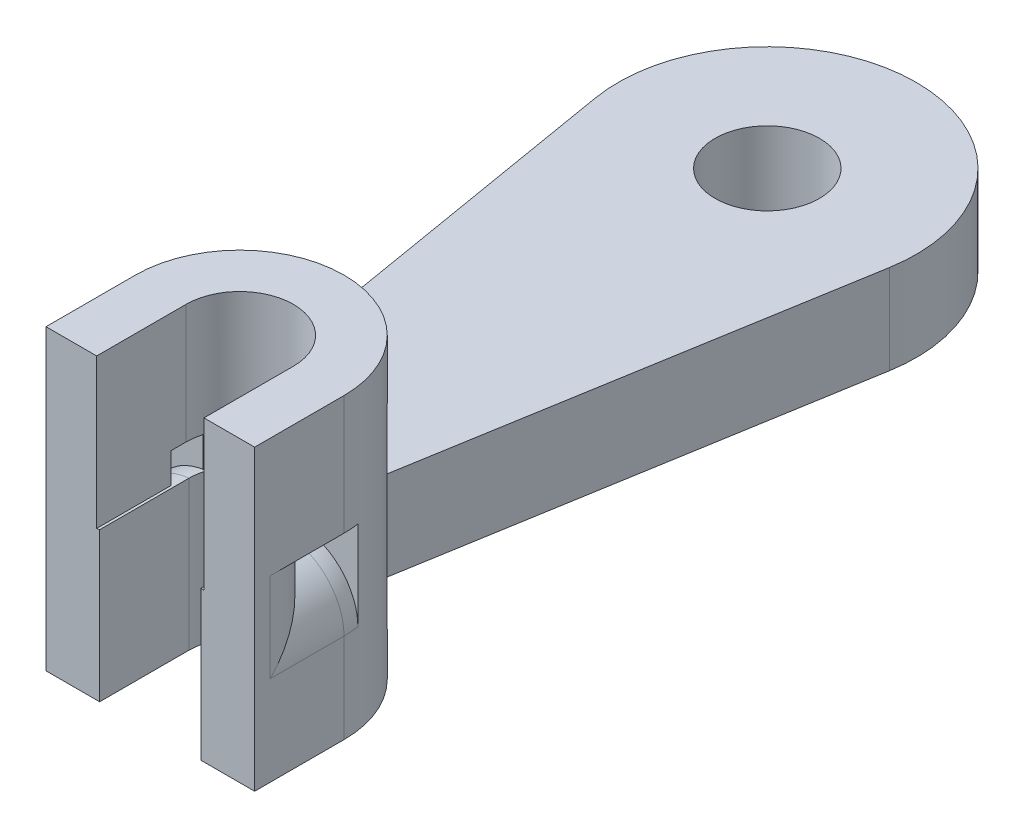
ISO-10303-21;
HEADER;
FILE_DESCRIPTION(('STEP AP214'),'2;1');
FILE_NAME('part.step','',(''),(''),'','','');
FILE_SCHEMA(('AUTOMOTIVE_DESIGN { 1 0 10303 214 1 1 1 1 }'));
ENDSEC;
DATA;
#1=APPLICATION_CONTEXT('core data for automotive mechanical design processes');
#2=APPLICATION_PROTOCOL_DEFINITION('international standard','automotive_design',2000,#1);
#3=PRODUCT_CONTEXT('',#1,'mechanical');
#4=PRODUCT('Part','Part','',(#3));
#5=PRODUCT_RELATED_PRODUCT_CATEGORY('part','',(#4));
#6=PRODUCT_DEFINITION_FORMATION('','',#4);
#7=PRODUCT_DEFINITION_CONTEXT('part definition',#1,'design');
#8=PRODUCT_DEFINITION('design','',#6,#7);
#9=PRODUCT_DEFINITION_SHAPE('','',#8);
#10=(LENGTH_UNIT() NAMED_UNIT(*) SI_UNIT(.MILLI.,.METRE.));
#11=(NAMED_UNIT(*) PLANE_ANGLE_UNIT() SI_UNIT($,.RADIAN.));
#12=(NAMED_UNIT(*) SI_UNIT($,.STERADIAN.) SOLID_ANGLE_UNIT());
#13=UNCERTAINTY_MEASURE_WITH_UNIT(LENGTH_MEASURE(1.E-05),#10,'distance_accuracy_value','');
#14=(GEOMETRIC_REPRESENTATION_CONTEXT(3) GLOBAL_UNCERTAINTY_ASSIGNED_CONTEXT((#13)) GLOBAL_UNIT_ASSIGNED_CONTEXT((#10,
#11,#12)) REPRESENTATION_CONTEXT('',''));
#15=CARTESIAN_POINT('',(0.,0.,0.));
#16=DIRECTION('',(0.,0.,1.));
#17=DIRECTION('',(1.,0.,0.));
#18=AXIS2_PLACEMENT_3D('',#15,#16,#17);
#19=CARTESIAN_POINT('',(0.,5.,0.));
#20=DIRECTION('',(0.,-1.,0.));
#21=DIRECTION('',(0.,0.,-1.));
#22=AXIS2_PLACEMENT_3D('',#19,#20,#21);
#23=CYLINDRICAL_SURFACE('',#22,3.5);
#24=DIRECTION('',(0.,-1.,0.));
#25=VECTOR('',#24,1.);
#26=CARTESIAN_POINT('',(3.46410161513775,5.,-0.500000000000001));
#27=LINE('',#26,#25);
#28=CARTESIAN_POINT('',(3.46410161513776,6.,-0.5));
#29=VERTEX_POINT('',#28);
#30=CARTESIAN_POINT('',(3.46410161513775,3.01002512578676,-0.500000000000001));
#31=VERTEX_POINT('',#30);
#32=EDGE_CURVE('E296',#29,#31,#27,.T.);
#33=ORIENTED_EDGE('',*,*,#32,.T.);
#34=CARTESIAN_POINT('',(0.,3.01002512578676,0.));
#35=DIRECTION('',(0.,1.,0.));
#36=DIRECTION('',(0.,0.,1.));
#37=AXIS2_PLACEMENT_3D('',#34,#35,#36);
#38=CIRCLE('',#37,3.5);
#39=CARTESIAN_POINT('',(3.5,3.01002512578676,0.));
#40=VERTEX_POINT('',#39);
#41=EDGE_CURVE('E454',#31,#40,#38,.F.);
#42=ORIENTED_EDGE('',*,*,#41,.T.);
#43=DIRECTION('',(0.,-1.,0.));
#44=VECTOR('',#43,1.);
#45=CARTESIAN_POINT('',(3.5,5.,0.));
#46=LINE('',#45,#44);
#47=CARTESIAN_POINT('',(3.5,0.,0.));
#48=VERTEX_POINT('',#47);
#49=EDGE_CURVE('E403',#40,#48,#46,.T.);
#50=ORIENTED_EDGE('',*,*,#49,.T.);
#51=CARTESIAN_POINT('',(0.,0.,0.));
#52=DIRECTION('',(0.,1.,0.));
#53=DIRECTION('',(0.,0.,1.));
#54=AXIS2_PLACEMENT_3D('',#51,#52,#53);
#55=CIRCLE('',#54,3.5);
#56=CARTESIAN_POINT('',(-3.5,0.,0.));
#57=VERTEX_POINT('',#56);
#58=EDGE_CURVE('E374',#48,#57,#55,.T.);
#59=ORIENTED_EDGE('',*,*,#58,.T.);
#60=DIRECTION('',(0.,-1.,0.));
#61=VECTOR('',#60,1.);
#62=CARTESIAN_POINT('',(-3.5,5.,0.));
#63=LINE('',#62,#61);
#64=CARTESIAN_POINT('',(-3.5,3.01002512578676,0.));
#65=VERTEX_POINT('',#64);
#66=EDGE_CURVE('E398',#65,#57,#63,.T.);
#67=ORIENTED_EDGE('',*,*,#66,.F.);
#68=CARTESIAN_POINT('',(0.,3.01002512578676,0.));
#69=DIRECTION('',(0.,1.,0.));
#70=DIRECTION('',(0.,0.,1.));
#71=AXIS2_PLACEMENT_3D('',#68,#69,#70);
#72=CIRCLE('',#71,3.5);
#73=CARTESIAN_POINT('',(-3.46410161513775,3.01002512578676,-0.500000000000001));
#74=VERTEX_POINT('',#73);
#75=EDGE_CURVE('E450',#65,#74,#72,.F.);
#76=ORIENTED_EDGE('',*,*,#75,.T.);
#77=DIRECTION('',(0.,-1.,0.));
#78=VECTOR('',#77,1.);
#79=CARTESIAN_POINT('',(-3.46410161513775,5.,-0.500000000000001));
#80=LINE('',#79,#78);
#81=CARTESIAN_POINT('',(-3.46410161513775,6.,-0.5));
#82=VERTEX_POINT('',#81);
#83=EDGE_CURVE('E292',#74,#82,#80,.F.);
#84=ORIENTED_EDGE('',*,*,#83,.T.);
#85=CARTESIAN_POINT('',(0.,6.,0.));
#86=DIRECTION('',(0.,1.,0.));
#87=DIRECTION('',(0.,0.,1.));
#88=AXIS2_PLACEMENT_3D('',#85,#86,#87);
#89=CIRCLE('',#88,3.5);
#90=CARTESIAN_POINT('',(-3.5,6.,0.));
#91=VERTEX_POINT('',#90);
#92=EDGE_CURVE('E283',#82,#91,#89,.T.);
#93=ORIENTED_EDGE('',*,*,#92,.T.);
#94=CARTESIAN_POINT('',(-3.5,10.,0.));
#95=VERTEX_POINT('',#94);
#96=EDGE_CURVE('E399',#95,#91,#63,.T.);
#97=ORIENTED_EDGE('',*,*,#96,.F.);
#98=CARTESIAN_POINT('',(0.,10.,0.));
#99=DIRECTION('',(0.,1.,0.));
#100=DIRECTION('',(0.,0.,1.));
#101=AXIS2_PLACEMENT_3D('',#98,#99,#100);
#102=CIRCLE('',#101,3.5);
#103=CARTESIAN_POINT('',(3.5,10.,0.));
#104=VERTEX_POINT('',#103);
#105=EDGE_CURVE('E317',#104,#95,#102,.T.);
#106=ORIENTED_EDGE('',*,*,#105,.F.);
#107=CARTESIAN_POINT('',(3.5,6.,0.));
#108=VERTEX_POINT('',#107);
#109=EDGE_CURVE('E404',#104,#108,#46,.T.);
#110=ORIENTED_EDGE('',*,*,#109,.T.);
#111=EDGE_CURVE('E287',#108,#29,#89,.T.);
#112=ORIENTED_EDGE('',*,*,#111,.T.);
#113=EDGE_LOOP('',(#33,#42,#50,#59,#67,#76,#84,#93,#97,#106,#110,#112));
#114=FACE_BOUND('',#113,.T.);
#115=DIRECTION('',(0.,1.,0.));
#116=VECTOR('',#115,1.);
#117=CARTESIAN_POINT('',(2.5,3.,-2.44948974278318));
#118=LINE('',#117,#116);
#119=CARTESIAN_POINT('',(2.5,3.,-2.44948974278318));
#120=VERTEX_POINT('',#119);
#121=CARTESIAN_POINT('',(2.5,6.,-2.44948974278318));
#122=VERTEX_POINT('',#121);
#123=EDGE_CURVE('E67',#120,#122,#118,.T.);
#124=ORIENTED_EDGE('',*,*,#123,.T.);
#125=CARTESIAN_POINT('',(0.,6.,0.));
#126=DIRECTION('',(0.,1.,0.));
#127=DIRECTION('',(0.,0.,-1.));
#128=AXIS2_PLACEMENT_3D('',#125,#126,#127);
#129=CIRCLE('',#128,3.5);
#130=CARTESIAN_POINT('',(-2.5,6.,-2.44948974278318));
#131=VERTEX_POINT('',#130);
#132=EDGE_CURVE('E916',#122,#131,#129,.T.);
#133=ORIENTED_EDGE('',*,*,#132,.T.);
#134=DIRECTION('',(0.,1.,0.));
#135=VECTOR('',#134,1.);
#136=CARTESIAN_POINT('',(-2.5,3.,-2.44948974278318));
#137=LINE('',#136,#135);
#138=CARTESIAN_POINT('',(-2.5,3.,-2.44948974278318));
#139=VERTEX_POINT('',#138);
#140=EDGE_CURVE('E258',#139,#131,#137,.T.);
#141=ORIENTED_EDGE('',*,*,#140,.F.);
#142=CARTESIAN_POINT('',(0.,3.,0.));
#143=DIRECTION('',(0.,1.,0.));
#144=DIRECTION('',(0.,0.,-1.));
#145=AXIS2_PLACEMENT_3D('',#142,#143,#144);
#146=CIRCLE('',#145,3.5);
#147=EDGE_CURVE('E62',#120,#139,#146,.T.);
#148=ORIENTED_EDGE('',*,*,#147,.F.);
#149=EDGE_LOOP('',(#124,#133,#141,#148));
#150=FACE_BOUND('',#149,.T.);
#151=ADVANCED_FACE('F43',(#114,#150),#23,.T.);
#152=CARTESIAN_POINT('',(0.,5.,0.));
#153=DIRECTION('',(0.,1.,0.));
#154=DIRECTION('',(0.,0.,1.));
#155=AXIS2_PLACEMENT_3D('',#152,#153,#154);
#156=PLANE('',#155);
#157=CARTESIAN_POINT('',(0.,5.,0.));
#158=DIRECTION('',(0.,-1.,0.));
#159=DIRECTION('',(0.,0.,1.));
#160=AXIS2_PLACEMENT_3D('',#157,#158,#159);
#161=CIRCLE('',#160,1.7);
#162=CARTESIAN_POINT('',(-1.62480768092721,5.,-0.499999999999946));
#163=VERTEX_POINT('',#162);
#164=CARTESIAN_POINT('',(1.62480768092719,5.,-0.500000000000001));
#165=VERTEX_POINT('',#164);
#166=EDGE_CURVE('E351',#163,#165,#161,.T.);
#167=ORIENTED_EDGE('',*,*,#166,.T.);
#168=DIRECTION('',(1.,0.,0.));
#169=VECTOR('',#168,1.);
#170=CARTESIAN_POINT('',(-3.5,5.,-0.500000000000001));
#171=LINE('',#170,#169);
#172=CARTESIAN_POINT('',(1.72916164657906,5.,-0.500000000000001));
#173=VERTEX_POINT('',#172);
#174=EDGE_CURVE('E464',#165,#173,#171,.T.);
#175=ORIENTED_EDGE('',*,*,#174,.T.);
#176=CARTESIAN_POINT('',(0.,5.,0.));
#177=DIRECTION('',(0.,-1.,0.));
#178=DIRECTION('',(0.,0.,1.));
#179=AXIS2_PLACEMENT_3D('',#176,#177,#178);
#180=CIRCLE('',#179,1.8);
#181=CARTESIAN_POINT('',(-1.72916164657906,5.,-0.500000000000001));
#182=VERTEX_POINT('',#181);
#183=EDGE_CURVE('E299',#182,#173,#180,.T.);
#184=ORIENTED_EDGE('',*,*,#183,.F.);
#185=DIRECTION('',(1.,0.,0.));
#186=VECTOR('',#185,1.);
#187=CARTESIAN_POINT('',(-3.5,5.,-0.500000000000001));
#188=LINE('',#187,#186);
#189=EDGE_CURVE('E460',#182,#163,#188,.T.);
#190=ORIENTED_EDGE('',*,*,#189,.T.);
#191=EDGE_LOOP('',(#167,#175,#184,#190));
#192=FACE_BOUND('',#191,.T.);
#193=ADVANCED_FACE('F544',(#192),#156,.T.);
#194=CARTESIAN_POINT('',(0.,5.,0.));
#195=DIRECTION('',(0.,-1.,0.));
#196=DIRECTION('',(0.,0.,-1.));
#197=AXIS2_PLACEMENT_3D('',#194,#195,#196);
#198=CYLINDRICAL_SURFACE('',#197,1.7);
#199=CARTESIAN_POINT('',(0.,0.,0.));
#200=DIRECTION('',(0.,-1.,0.));
#201=DIRECTION('',(0.,0.,1.));
#202=AXIS2_PLACEMENT_3D('',#199,#200,#201);
#203=CIRCLE('',#202,1.7);
#204=CARTESIAN_POINT('',(-1.7,0.,0.));
#205=VERTEX_POINT('',#204);
#206=CARTESIAN_POINT('',(1.7,0.,0.));
#207=VERTEX_POINT('',#206);
#208=EDGE_CURVE('E345',#205,#207,#203,.T.);
#209=ORIENTED_EDGE('',*,*,#208,.T.);
#210=DIRECTION('',(0.,-1.,0.));
#211=VECTOR('',#210,1.);
#212=CARTESIAN_POINT('',(1.7,5.,0.));
#213=LINE('',#212,#211);
#214=CARTESIAN_POINT('',(1.7,5.,0.));
#215=VERTEX_POINT('',#214);
#216=EDGE_CURVE('E416',#215,#207,#213,.T.);
#217=ORIENTED_EDGE('',*,*,#216,.F.);
#218=EDGE_CURVE('E352',#165,#215,#161,.T.);
#219=ORIENTED_EDGE('',*,*,#218,.F.);
#220=ORIENTED_EDGE('',*,*,#166,.F.);
#221=CARTESIAN_POINT('',(-1.7,5.,0.));
#222=VERTEX_POINT('',#221);
#223=EDGE_CURVE('E346',#222,#163,#161,.T.);
#224=ORIENTED_EDGE('',*,*,#223,.F.);
#225=DIRECTION('',(0.,-1.,0.));
#226=VECTOR('',#225,1.);
#227=CARTESIAN_POINT('',(-1.7,5.,0.));
#228=LINE('',#227,#226);
#229=EDGE_CURVE('E360',#222,#205,#228,.T.);
#230=ORIENTED_EDGE('',*,*,#229,.T.);
#231=EDGE_LOOP('',(#209,#217,#219,#220,#224,#230));
#232=FACE_BOUND('',#231,.T.);
#233=ADVANCED_FACE('F550',(#232),#198,.F.);
#234=CARTESIAN_POINT('',(1.7,5.,0.));
#235=DIRECTION('',(1.,0.,0.));
#236=DIRECTION('',(0.,0.,-1.));
#237=AXIS2_PLACEMENT_3D('',#234,#235,#236);
#238=PLANE('',#237);
#239=DIRECTION('',(0.,0.,1.));
#240=VECTOR('',#239,1.);
#241=CARTESIAN_POINT('',(1.7,0.,0.));
#242=LINE('',#241,#240);
#243=CARTESIAN_POINT('',(1.7,0.,3.));
#244=VERTEX_POINT('',#243);
#245=EDGE_CURVE('E364',#207,#244,#242,.T.);
#246=ORIENTED_EDGE('',*,*,#245,.T.);
#247=DIRECTION('',(0.,-1.,0.));
#248=VECTOR('',#247,1.);
#249=CARTESIAN_POINT('',(1.7,5.,3.));
#250=LINE('',#249,#248);
#251=CARTESIAN_POINT('',(1.7,5.,3.));
#252=VERTEX_POINT('',#251);
#253=EDGE_CURVE('E412',#252,#244,#250,.T.);
#254=ORIENTED_EDGE('',*,*,#253,.F.);
#255=DIRECTION('',(0.,0.,1.));
#256=VECTOR('',#255,1.);
#257=CARTESIAN_POINT('',(1.7,5.,0.));
#258=LINE('',#257,#256);
#259=EDGE_CURVE('E350',#215,#252,#258,.T.);
#260=ORIENTED_EDGE('',*,*,#259,.F.);
#261=ORIENTED_EDGE('',*,*,#216,.T.);
#262=EDGE_LOOP('',(#246,#254,#260,#261));
#263=FACE_BOUND('',#262,.T.);
#264=ADVANCED_FACE('F564',(#263),#238,.F.);
#265=CARTESIAN_POINT('',(3.5,5.,3.));
#266=DIRECTION('',(0.,0.,-1.));
#267=DIRECTION('',(-1.,0.,0.));
#268=AXIS2_PLACEMENT_3D('',#265,#266,#267);
#269=PLANE('',#268);
#270=DIRECTION('',(0.,-1.,0.));
#271=VECTOR('',#270,1.);
#272=CARTESIAN_POINT('',(1.8,10.,3.));
#273=LINE('',#272,#271);
#274=CARTESIAN_POINT('',(1.8,10.,3.));
#275=VERTEX_POINT('',#274);
#276=CARTESIAN_POINT('',(1.8,4.98739711911528,3.));
#277=VERTEX_POINT('',#276);
#278=EDGE_CURVE('E334',#275,#277,#273,.T.);
#279=ORIENTED_EDGE('',*,*,#278,.T.);
#280=CARTESIAN_POINT('',(1.5,3.01002512578676,3.));
#281=DIRECTION('',(0.,0.,-1.));
#282=DIRECTION('',(-1.,0.,0.));
#283=AXIS2_PLACEMENT_3D('',#280,#281,#282);
#284=CIRCLE('',#283,2.);
#285=EDGE_CURVE('E457',#277,#252,#284,.F.);
#286=ORIENTED_EDGE('',*,*,#285,.T.);
#287=ORIENTED_EDGE('',*,*,#253,.T.);
#288=DIRECTION('',(1.,0.,0.));
#289=VECTOR('',#288,1.);
#290=CARTESIAN_POINT('',(3.5,0.,3.));
#291=LINE('',#290,#289);
#292=CARTESIAN_POINT('',(3.5,0.,3.));
#293=VERTEX_POINT('',#292);
#294=EDGE_CURVE('E367',#244,#293,#291,.T.);
#295=ORIENTED_EDGE('',*,*,#294,.T.);
#296=DIRECTION('',(0.,-1.,0.));
#297=VECTOR('',#296,1.);
#298=CARTESIAN_POINT('',(3.5,5.,3.));
#299=LINE('',#298,#297);
#300=CARTESIAN_POINT('',(3.5,10.,3.));
#301=VERTEX_POINT('',#300);
#302=EDGE_CURVE('E408',#301,#293,#299,.T.);
#303=ORIENTED_EDGE('',*,*,#302,.F.);
#304=DIRECTION('',(1.,0.,0.));
#305=VECTOR('',#304,1.);
#306=CARTESIAN_POINT('',(1.8,10.,3.));
#307=LINE('',#306,#305);
#308=EDGE_CURVE('E309',#275,#301,#307,.T.);
#309=ORIENTED_EDGE('',*,*,#308,.F.);
#310=EDGE_LOOP('',(#279,#286,#287,#295,#303,#309));
#311=FACE_BOUND('',#310,.T.);
#312=ADVANCED_FACE('F560',(#311),#269,.F.);
#313=CARTESIAN_POINT('',(3.5,5.,0.));
#314=DIRECTION('',(-1.,0.,0.));
#315=DIRECTION('',(0.,0.,1.));
#316=AXIS2_PLACEMENT_3D('',#313,#314,#315);
#317=PLANE('',#316);
#318=DIRECTION('',(0.,1.,0.));
#319=VECTOR('',#318,1.);
#320=CARTESIAN_POINT('',(3.5,5.,2.47737199332852));
#321=LINE('',#320,#319);
#322=CARTESIAN_POINT('',(3.5,3.01002512578676,2.47737199332852));
#323=VERTEX_POINT('',#322);
#324=CARTESIAN_POINT('',(3.5,6.,2.47737199332852));
#325=VERTEX_POINT('',#324);
#326=EDGE_CURVE('E439',#323,#325,#321,.T.);
#327=ORIENTED_EDGE('',*,*,#326,.T.);
#328=DIRECTION('',(0.,0.,1.));
#329=VECTOR('',#328,1.);
#330=CARTESIAN_POINT('',(3.5,6.,0.5));
#331=LINE('',#330,#329);
#332=EDGE_CURVE('E262',#108,#325,#331,.T.);
#333=ORIENTED_EDGE('',*,*,#332,.F.);
#334=ORIENTED_EDGE('',*,*,#109,.F.);
#335=DIRECTION('',(0.,0.,-1.));
#336=VECTOR('',#335,1.);
#337=CARTESIAN_POINT('',(3.5,10.,3.));
#338=LINE('',#337,#336);
#339=EDGE_CURVE('E313',#301,#104,#338,.T.);
#340=ORIENTED_EDGE('',*,*,#339,.F.);
#341=ORIENTED_EDGE('',*,*,#302,.T.);
#342=DIRECTION('',(0.,0.,-1.));
#343=VECTOR('',#342,1.);
#344=CARTESIAN_POINT('',(3.5,0.,0.));
#345=LINE('',#344,#343);
#346=EDGE_CURVE('E370',#293,#48,#345,.T.);
#347=ORIENTED_EDGE('',*,*,#346,.T.);
#348=ORIENTED_EDGE('',*,*,#49,.F.);
#349=DIRECTION('',(0.,0.,-1.));
#350=VECTOR('',#349,1.);
#351=CARTESIAN_POINT('',(3.5,3.01002512578676,0.));
#352=LINE('',#351,#350);
#353=EDGE_CURVE('E436',#40,#323,#352,.F.);
#354=ORIENTED_EDGE('',*,*,#353,.T.);
#355=EDGE_LOOP('',(#327,#333,#334,#340,#341,#347,#348,#354));
#356=FACE_BOUND('',#355,.T.);
#357=ADVANCED_FACE('F557',(#356),#317,.F.);
#358=CARTESIAN_POINT('',(-3.5,5.,0.));
#359=DIRECTION('',(1.,0.,0.));
#360=DIRECTION('',(0.,0.,-1.));
#361=AXIS2_PLACEMENT_3D('',#358,#359,#360);
#362=PLANE('',#361);
#363=DIRECTION('',(0.,0.,1.));
#364=VECTOR('',#363,1.);
#365=CARTESIAN_POINT('',(-3.5,6.,0.5));
#366=LINE('',#365,#364);
#367=CARTESIAN_POINT('',(-3.5,6.,2.47737199332852));
#368=VERTEX_POINT('',#367);
#369=EDGE_CURVE('E265',#91,#368,#366,.T.);
#370=ORIENTED_EDGE('',*,*,#369,.T.);
#371=DIRECTION('',(0.,-1.,0.));
#372=VECTOR('',#371,1.);
#373=CARTESIAN_POINT('',(-3.5,5.,2.47737199332852));
#374=LINE('',#373,#372);
#375=CARTESIAN_POINT('',(-3.5,3.01002512578676,2.47737199332852));
#376=VERTEX_POINT('',#375);
#377=EDGE_CURVE('E446',#368,#376,#374,.T.);
#378=ORIENTED_EDGE('',*,*,#377,.T.);
#379=DIRECTION('',(0.,0.,1.));
#380=VECTOR('',#379,1.);
#381=CARTESIAN_POINT('',(-3.5,3.01002512578676,0.));
#382=LINE('',#381,#380);
#383=EDGE_CURVE('E443',#376,#65,#382,.F.);
#384=ORIENTED_EDGE('',*,*,#383,.T.);
#385=ORIENTED_EDGE('',*,*,#66,.T.);
#386=DIRECTION('',(0.,0.,1.));
#387=VECTOR('',#386,1.);
#388=CARTESIAN_POINT('',(-3.5,0.,0.));
#389=LINE('',#388,#387);
#390=CARTESIAN_POINT('',(-3.5,0.,3.));
#391=VERTEX_POINT('',#390);
#392=EDGE_CURVE('E378',#57,#391,#389,.T.);
#393=ORIENTED_EDGE('',*,*,#392,.T.);
#394=DIRECTION('',(0.,-1.,0.));
#395=VECTOR('',#394,1.);
#396=CARTESIAN_POINT('',(-3.5,5.,3.));
#397=LINE('',#396,#395);
#398=CARTESIAN_POINT('',(-3.5,10.,3.));
#399=VERTEX_POINT('',#398);
#400=EDGE_CURVE('E394',#399,#391,#397,.T.);
#401=ORIENTED_EDGE('',*,*,#400,.F.);
#402=DIRECTION('',(0.,0.,1.));
#403=VECTOR('',#402,1.);
#404=CARTESIAN_POINT('',(-3.5,10.,0.));
#405=LINE('',#404,#403);
#406=EDGE_CURVE('E321',#95,#399,#405,.T.);
#407=ORIENTED_EDGE('',*,*,#406,.F.);
#408=ORIENTED_EDGE('',*,*,#96,.T.);
#409=EDGE_LOOP('',(#370,#378,#384,#385,#393,#401,#407,#408));
#410=FACE_BOUND('',#409,.T.);
#411=ADVANCED_FACE('F555',(#410),#362,.F.);
#412=CARTESIAN_POINT('',(-1.7,5.,3.));
#413=DIRECTION('',(0.,0.,-1.));
#414=DIRECTION('',(-1.,0.,0.));
#415=AXIS2_PLACEMENT_3D('',#412,#413,#414);
#416=PLANE('',#415);
#417=CARTESIAN_POINT('',(-1.5,3.01002512578676,3.));
#418=DIRECTION('',(0.,0.,-1.));
#419=DIRECTION('',(-1.,0.,0.));
#420=AXIS2_PLACEMENT_3D('',#417,#418,#419);
#421=CIRCLE('',#420,2.);
#422=CARTESIAN_POINT('',(-1.7,5.,3.));
#423=VERTEX_POINT('',#422);
#424=CARTESIAN_POINT('',(-1.8,4.98739711911528,3.));
#425=VERTEX_POINT('',#424);
#426=EDGE_CURVE('E467',#423,#425,#421,.F.);
#427=ORIENTED_EDGE('',*,*,#426,.T.);
#428=DIRECTION('',(0.,-1.,0.));
#429=VECTOR('',#428,1.);
#430=CARTESIAN_POINT('',(-1.8,10.,3.));
#431=LINE('',#430,#429);
#432=CARTESIAN_POINT('',(-1.8,10.,3.));
#433=VERTEX_POINT('',#432);
#434=EDGE_CURVE('E328',#433,#425,#431,.T.);
#435=ORIENTED_EDGE('',*,*,#434,.F.);
#436=DIRECTION('',(1.,0.,0.));
#437=VECTOR('',#436,1.);
#438=CARTESIAN_POINT('',(-3.5,10.,3.));
#439=LINE('',#438,#437);
#440=EDGE_CURVE('E325',#399,#433,#439,.T.);
#441=ORIENTED_EDGE('',*,*,#440,.F.);
#442=ORIENTED_EDGE('',*,*,#400,.T.);
#443=DIRECTION('',(1.,0.,0.));
#444=VECTOR('',#443,1.);
#445=CARTESIAN_POINT('',(-1.7,0.,3.));
#446=LINE('',#445,#444);
#447=CARTESIAN_POINT('',(-1.7,0.,3.));
#448=VERTEX_POINT('',#447);
#449=EDGE_CURVE('E381',#391,#448,#446,.T.);
#450=ORIENTED_EDGE('',*,*,#449,.T.);
#451=DIRECTION('',(0.,-1.,0.));
#452=VECTOR('',#451,1.);
#453=CARTESIAN_POINT('',(-1.7,5.,3.));
#454=LINE('',#453,#452);
#455=EDGE_CURVE('E390',#423,#448,#454,.T.);
#456=ORIENTED_EDGE('',*,*,#455,.F.);
#457=EDGE_LOOP('',(#427,#435,#441,#442,#450,#456));
#458=FACE_BOUND('',#457,.T.);
#459=ADVANCED_FACE('F627',(#458),#416,.F.);
#460=CARTESIAN_POINT('',(-1.7,5.,0.));
#461=DIRECTION('',(-1.,0.,0.));
#462=DIRECTION('',(0.,0.,1.));
#463=AXIS2_PLACEMENT_3D('',#460,#461,#462);
#464=PLANE('',#463);
#465=DIRECTION('',(0.,0.,-1.));
#466=VECTOR('',#465,1.);
#467=CARTESIAN_POINT('',(-1.7,0.,0.));
#468=LINE('',#467,#466);
#469=EDGE_CURVE('E384',#448,#205,#468,.T.);
#470=ORIENTED_EDGE('',*,*,#469,.T.);
#471=ORIENTED_EDGE('',*,*,#229,.F.);
#472=DIRECTION('',(0.,0.,-1.));
#473=VECTOR('',#472,1.);
#474=CARTESIAN_POINT('',(-1.7,5.,0.));
#475=LINE('',#474,#473);
#476=EDGE_CURVE('E356',#423,#222,#475,.T.);
#477=ORIENTED_EDGE('',*,*,#476,.F.);
#478=ORIENTED_EDGE('',*,*,#455,.T.);
#479=EDGE_LOOP('',(#470,#471,#477,#478));
#480=FACE_BOUND('',#479,.T.);
#481=ADVANCED_FACE('F631',(#480),#464,.F.);
#482=CARTESIAN_POINT('',(0.,0.,0.));
#483=DIRECTION('',(0.,1.,0.));
#484=DIRECTION('',(0.,0.,1.));
#485=AXIS2_PLACEMENT_3D('',#482,#483,#484);
#486=PLANE('',#485);
#487=ORIENTED_EDGE('',*,*,#208,.F.);
#488=ORIENTED_EDGE('',*,*,#469,.F.);
#489=ORIENTED_EDGE('',*,*,#449,.F.);
#490=ORIENTED_EDGE('',*,*,#392,.F.);
#491=ORIENTED_EDGE('',*,*,#58,.F.);
#492=ORIENTED_EDGE('',*,*,#346,.F.);
#493=ORIENTED_EDGE('',*,*,#294,.F.);
#494=ORIENTED_EDGE('',*,*,#245,.F.);
#495=EDGE_LOOP('',(#487,#488,#489,#490,#491,#492,#493,#494));
#496=FACE_BOUND('',#495,.T.);
#497=ADVANCED_FACE('F653',(#496),#486,.F.);
#498=CARTESIAN_POINT('',(-1.8,10.,2.9));
#499=DIRECTION('',(-1.,0.,0.));
#500=DIRECTION('',(0.,0.,1.));
#501=AXIS2_PLACEMENT_3D('',#498,#499,#500);
#502=PLANE('',#501);
#503=ORIENTED_EDGE('',*,*,#434,.T.);
#504=DIRECTION('',(0.,0.,1.));
#505=VECTOR('',#504,1.);
#506=CARTESIAN_POINT('',(-1.8,4.98739711911528,3.));
#507=LINE('',#506,#505);
#508=CARTESIAN_POINT('',(-1.8,4.98739711911528,0.5));
#509=VERTEX_POINT('',#508);
#510=EDGE_CURVE('E11',#425,#509,#507,.F.);
#511=ORIENTED_EDGE('',*,*,#510,.T.);
#512=CARTESIAN_POINT('',(-1.8,4.98739711911528,0.5));
#513=CARTESIAN_POINT('',(-1.8,5.,0.5));
#514=B_SPLINE_CURVE_WITH_KNOTS('',1,(#512,#513),.UNSPECIFIED.,.F.,.F.,(2,2),(0.,1.),.UNSPECIFIED.);
#515=CARTESIAN_POINT('',(-1.8,5.,0.5));
#516=VERTEX_POINT('',#515);
#517=EDGE_CURVE('E492',#509,#516,#514,.T.);
#518=ORIENTED_EDGE('',*,*,#517,.T.);
#519=DIRECTION('',(0.,1.,0.));
#520=VECTOR('',#519,1.);
#521=CARTESIAN_POINT('',(-1.8,10.,0.5));
#522=LINE('',#521,#520);
#523=CARTESIAN_POINT('',(-1.8,6.,0.5));
#524=VERTEX_POINT('',#523);
#525=EDGE_CURVE('E288',#516,#524,#522,.T.);
#526=ORIENTED_EDGE('',*,*,#525,.T.);
#527=DIRECTION('',(0.,0.,-1.));
#528=VECTOR('',#527,1.);
#529=CARTESIAN_POINT('',(-1.8,6.,2.9));
#530=LINE('',#529,#528);
#531=CARTESIAN_POINT('',(-1.8,6.,0.));
#532=VERTEX_POINT('',#531);
#533=EDGE_CURVE('E279',#524,#532,#530,.T.);
#534=ORIENTED_EDGE('',*,*,#533,.T.);
#535=DIRECTION('',(0.,-1.,0.));
#536=VECTOR('',#535,1.);
#537=CARTESIAN_POINT('',(-1.8,10.,0.));
#538=LINE('',#537,#536);
#539=CARTESIAN_POINT('',(-1.8,10.,0.));
#540=VERTEX_POINT('',#539);
#541=EDGE_CURVE('E341',#540,#532,#538,.T.);
#542=ORIENTED_EDGE('',*,*,#541,.F.);
#543=DIRECTION('',(0.,0.,-1.));
#544=VECTOR('',#543,1.);
#545=CARTESIAN_POINT('',(-1.8,10.,2.9));
#546=LINE('',#545,#544);
#547=EDGE_CURVE('E300',#433,#540,#546,.T.);
#548=ORIENTED_EDGE('',*,*,#547,.F.);
#549=EDGE_LOOP('',(#503,#511,#518,#526,#534,#542,#548));
#550=FACE_BOUND('',#549,.T.);
#551=ADVANCED_FACE('F621',(#550),#502,.F.);
#552=CARTESIAN_POINT('',(0.,10.,0.));
#553=DIRECTION('',(0.,-1.,0.));
#554=DIRECTION('',(0.,0.,-1.));
#555=AXIS2_PLACEMENT_3D('',#552,#553,#554);
#556=CYLINDRICAL_SURFACE('',#555,1.8);
#557=DIRECTION('',(0.,-1.,0.));
#558=VECTOR('',#557,1.);
#559=CARTESIAN_POINT('',(1.72916164657906,10.,-0.499999999999997));
#560=LINE('',#559,#558);
#561=CARTESIAN_POINT('',(1.72916164657906,6.,-0.5));
#562=VERTEX_POINT('',#561);
#563=EDGE_CURVE('E432',#173,#562,#560,.F.);
#564=ORIENTED_EDGE('',*,*,#563,.T.);
#565=CARTESIAN_POINT('',(0.,6.,0.));
#566=DIRECTION('',(0.,1.,0.));
#567=DIRECTION('',(0.,0.,1.));
#568=AXIS2_PLACEMENT_3D('',#565,#566,#567);
#569=CIRCLE('',#568,1.8);
#570=CARTESIAN_POINT('',(1.8,6.,0.));
#571=VERTEX_POINT('',#570);
#572=EDGE_CURVE('E274',#562,#571,#569,.F.);
#573=ORIENTED_EDGE('',*,*,#572,.T.);
#574=DIRECTION('',(0.,-1.,0.));
#575=VECTOR('',#574,1.);
#576=CARTESIAN_POINT('',(1.8,10.,0.));
#577=LINE('',#576,#575);
#578=CARTESIAN_POINT('',(1.8,10.,0.));
#579=VERTEX_POINT('',#578);
#580=EDGE_CURVE('E337',#579,#571,#577,.T.);
#581=ORIENTED_EDGE('',*,*,#580,.F.);
#582=CARTESIAN_POINT('',(0.,10.,0.));
#583=DIRECTION('',(0.,-1.,0.));
#584=DIRECTION('',(0.,0.,1.));
#585=AXIS2_PLACEMENT_3D('',#582,#583,#584);
#586=CIRCLE('',#585,1.8);
#587=EDGE_CURVE('E303',#540,#579,#586,.T.);
#588=ORIENTED_EDGE('',*,*,#587,.F.);
#589=ORIENTED_EDGE('',*,*,#541,.T.);
#590=CARTESIAN_POINT('',(-1.72916164657906,6.,-0.5));
#591=VERTEX_POINT('',#590);
#592=EDGE_CURVE('E278',#532,#591,#569,.F.);
#593=ORIENTED_EDGE('',*,*,#592,.T.);
#594=DIRECTION('',(0.,-1.,0.));
#595=VECTOR('',#594,1.);
#596=CARTESIAN_POINT('',(-1.72916164657906,10.,-0.499999999999997));
#597=LINE('',#596,#595);
#598=EDGE_CURVE('E428',#591,#182,#597,.T.);
#599=ORIENTED_EDGE('',*,*,#598,.T.);
#600=ORIENTED_EDGE('',*,*,#183,.T.);
#601=EDGE_LOOP('',(#564,#573,#581,#588,#589,#593,#599,#600));
#602=FACE_BOUND('',#601,.T.);
#603=ADVANCED_FACE('F644',(#602),#556,.F.);
#604=CARTESIAN_POINT('',(1.8,10.,2.9));
#605=DIRECTION('',(1.,0.,0.));
#606=DIRECTION('',(0.,0.,-1.));
#607=AXIS2_PLACEMENT_3D('',#604,#605,#606);
#608=PLANE('',#607);
#609=DIRECTION('',(0.,0.,1.));
#610=VECTOR('',#609,1.);
#611=CARTESIAN_POINT('',(1.8,6.,2.9));
#612=LINE('',#611,#610);
#613=CARTESIAN_POINT('',(1.8,6.,0.5));
#614=VERTEX_POINT('',#613);
#615=EDGE_CURVE('E420',#571,#614,#612,.T.);
#616=ORIENTED_EDGE('',*,*,#615,.T.);
#617=DIRECTION('',(0.,-1.,0.));
#618=VECTOR('',#617,1.);
#619=CARTESIAN_POINT('',(1.8,10.,0.5));
#620=LINE('',#619,#618);
#621=CARTESIAN_POINT('',(1.8,5.,0.5));
#622=VERTEX_POINT('',#621);
#623=EDGE_CURVE('E424',#614,#622,#620,.T.);
#624=ORIENTED_EDGE('',*,*,#623,.T.);
#625=CARTESIAN_POINT('',(1.8,5.,0.5));
#626=CARTESIAN_POINT('',(1.8,4.98739711911528,0.5));
#627=B_SPLINE_CURVE_WITH_KNOTS('',1,(#625,#626),.UNSPECIFIED.,.F.,.F.,(2,2),(0.,1.),.UNSPECIFIED.);
#628=CARTESIAN_POINT('',(1.8,4.98739711911528,0.5));
#629=VERTEX_POINT('',#628);
#630=EDGE_CURVE('E471',#622,#629,#627,.T.);
#631=ORIENTED_EDGE('',*,*,#630,.T.);
#632=DIRECTION('',(0.,0.,-1.));
#633=VECTOR('',#632,1.);
#634=CARTESIAN_POINT('',(1.8,4.98739711911528,0.5));
#635=LINE('',#634,#633);
#636=EDGE_CURVE('E505',#629,#277,#635,.F.);
#637=ORIENTED_EDGE('',*,*,#636,.T.);
#638=ORIENTED_EDGE('',*,*,#278,.F.);
#639=DIRECTION('',(0.,0.,1.));
#640=VECTOR('',#639,1.);
#641=CARTESIAN_POINT('',(1.8,10.,0.));
#642=LINE('',#641,#640);
#643=EDGE_CURVE('E306',#579,#275,#642,.T.);
#644=ORIENTED_EDGE('',*,*,#643,.F.);
#645=ORIENTED_EDGE('',*,*,#580,.T.);
#646=EDGE_LOOP('',(#616,#624,#631,#637,#638,#644,#645));
#647=FACE_BOUND('',#646,.T.);
#648=ADVANCED_FACE('F668',(#647),#608,.F.);
#649=CARTESIAN_POINT('',(0.,10.,0.));
#650=DIRECTION('',(0.,1.,0.));
#651=DIRECTION('',(0.,0.,1.));
#652=AXIS2_PLACEMENT_3D('',#649,#650,#651);
#653=PLANE('',#652);
#654=ORIENTED_EDGE('',*,*,#547,.T.);
#655=ORIENTED_EDGE('',*,*,#587,.T.);
#656=ORIENTED_EDGE('',*,*,#643,.T.);
#657=ORIENTED_EDGE('',*,*,#308,.T.);
#658=ORIENTED_EDGE('',*,*,#339,.T.);
#659=ORIENTED_EDGE('',*,*,#105,.T.);
#660=ORIENTED_EDGE('',*,*,#406,.T.);
#661=ORIENTED_EDGE('',*,*,#440,.T.);
#662=EDGE_LOOP('',(#654,#655,#656,#657,#658,#659,#660,#661));
#663=FACE_BOUND('',#662,.T.);
#664=ADVANCED_FACE('F489',(#663),#653,.T.);
#665=CARTESIAN_POINT('',(-3.5,6.,0.5));
#666=DIRECTION('',(0.,1.,0.));
#667=DIRECTION('',(0.,0.,1.));
#668=AXIS2_PLACEMENT_3D('',#665,#666,#667);
#669=PLANE('',#668);
#670=ORIENTED_EDGE('',*,*,#332,.T.);
#671=CARTESIAN_POINT('',(1.5,6.,2.47737199332852));
#672=DIRECTION('',(0.,1.,0.));
#673=DIRECTION('',(0.,0.,1.));
#674=AXIS2_PLACEMENT_3D('',#671,#672,#673);
#675=CIRCLE('',#674,2.);
#676=EDGE_CURVE('E476',#325,#614,#675,.T.);
#677=ORIENTED_EDGE('',*,*,#676,.T.);
#678=ORIENTED_EDGE('',*,*,#615,.F.);
#679=ORIENTED_EDGE('',*,*,#572,.F.);
#680=DIRECTION('',(1.,0.,0.));
#681=VECTOR('',#680,1.);
#682=CARTESIAN_POINT('',(-3.5,6.,-0.5));
#683=LINE('',#682,#681);
#684=EDGE_CURVE('E269',#562,#29,#683,.T.);
#685=ORIENTED_EDGE('',*,*,#684,.T.);
#686=ORIENTED_EDGE('',*,*,#111,.F.);
#687=EDGE_LOOP('',(#670,#677,#678,#679,#685,#686));
#688=FACE_BOUND('',#687,.T.);
#689=ADVANCED_FACE('F662',(#688),#669,.F.);
#690=CARTESIAN_POINT('',(-3.5,5.,-0.500000000000001));
#691=DIRECTION('',(0.,0.,-1.));
#692=DIRECTION('',(0.,1.,0.));
#693=AXIS2_PLACEMENT_3D('',#690,#691,#692);
#694=PLANE('',#693);
#695=ORIENTED_EDGE('',*,*,#684,.F.);
#696=ORIENTED_EDGE('',*,*,#563,.F.);
#697=ORIENTED_EDGE('',*,*,#174,.F.);
#698=CARTESIAN_POINT('',(1.62480768092739,5.,-0.500000000000001));
#699=CARTESIAN_POINT('',(1.68385549598294,4.99433919101073,-0.500000000000001));
#700=CARTESIAN_POINT('',(1.74267320747468,4.98622588291967,-0.500000000000001));
#701=CARTESIAN_POINT('',(1.85943179081181,4.96509122345224,-0.500000000000001));
#702=CARTESIAN_POINT('',(1.91737247583548,4.95206884124664,-0.500000000000001));
#703=CARTESIAN_POINT('',(2.03195206546535,4.92111080969876,-0.500000000000001));
#704=CARTESIAN_POINT('',(2.08859058178857,4.90317371495679,-0.500000000000001));
#705=CARTESIAN_POINT('',(2.20008641736241,4.86248329394947,-0.500000000000001));
#706=CARTESIAN_POINT('',(2.25494391626508,4.83973045520224,-0.500000000000001));
#707=CARTESIAN_POINT('',(2.41521842350224,4.76487114182948,-0.500000000000001));
#708=CARTESIAN_POINT('',(2.51751204780615,4.70584633484594,-0.500000000000001));
#709=CARTESIAN_POINT('',(2.71012359893551,4.57094410987847,-0.500000000000001));
#710=CARTESIAN_POINT('',(2.80045090581458,4.4950800180455,-0.500000000000001));
#711=CARTESIAN_POINT('',(2.96352229114025,4.33158468259416,-0.500000000000001));
#712=CARTESIAN_POINT('',(3.03676885447214,4.24445477788964,-0.500000000000001));
#713=CARTESIAN_POINT('',(3.16740881063452,4.05894612811753,-0.500000000000002));
#714=CARTESIAN_POINT('',(3.22479413473452,3.9605616936343,-0.500000000000002));
#715=CARTESIAN_POINT('',(3.32133930271031,3.75671634420603,-0.500000000000002));
#716=CARTESIAN_POINT('',(3.36071246214963,3.6513561276867,-0.500000000000002));
#717=CARTESIAN_POINT('',(3.42104673264882,3.4355970454122,-0.500000000000002));
#718=CARTESIAN_POINT('',(3.44203897775071,3.3252070343066,-0.500000000000002));
#719=CARTESIAN_POINT('',(3.45707984394828,3.18008239652697,-0.500000000000002));
#720=CARTESIAN_POINT('',(3.45971429160764,3.14609581600086,-0.500000000000002));
#721=CARTESIAN_POINT('',(3.46322278996443,3.078085788898,-0.500000000000002));
#722=CARTESIAN_POINT('',(3.46409961998636,3.04406248578233,-0.500000000000002));
#723=CARTESIAN_POINT('',(3.46410161513776,3.01002512578676,-0.500000000000002));
#724=B_SPLINE_CURVE_WITH_KNOTS('',3,(#698,#699,#700,#701,#702,#703,#704,#705,#706,#707,#708,
#709,#710,#711,#712,#713,#714,#715,#716,#717,#718,#719,#720,#721,#722,#723),.UNSPECIFIED.,.F.,
.F.,(4,2,2,2,2,2,2,2,2,2,2,2,4),(0.,0.177911569226834,0.355860517945525,0.533861857102063,
0.711845185041665,1.06421017377521,1.41629729839547,1.75613246063231,2.09614018269576,
2.43200979366016,2.76730939377969,2.86954386458287,2.97161654386382),.UNSPECIFIED.);
#725=EDGE_CURVE('E509',#165,#31,#724,.T.);
#726=ORIENTED_EDGE('',*,*,#725,.T.);
#727=ORIENTED_EDGE('',*,*,#32,.F.);
#728=EDGE_LOOP('',(#695,#696,#697,#726,#727));
#729=FACE_BOUND('',#728,.T.);
#730=ADVANCED_FACE('F486',(#729),#694,.F.);
#731=ORIENTED_EDGE('',*,*,#83,.F.);
#732=CARTESIAN_POINT('',(-3.46410161513775,3.01002512578676,-0.500000000000001));
#733=CARTESIAN_POINT('',(-3.46410137036071,3.0657937341121,-0.500000000000002));
#734=CARTESIAN_POINT('',(-3.46174334616753,3.12153555860969,-0.500000000000002));
#735=CARTESIAN_POINT('',(-3.45233712426163,3.23261879790544,-0.500000000000002));
#736=CARTESIAN_POINT('',(-3.44528919499326,3.28796023543798,-0.500000000000002));
#737=CARTESIAN_POINT('',(-3.41718174717165,3.45267686408789,-0.500000000000002));
#738=CARTESIAN_POINT('',(-3.3891583574296,3.56094616248183,-0.500000000000002));
#739=CARTESIAN_POINT('',(-3.31534006367645,3.77123628259208,-0.500000000000002));
#740=CARTESIAN_POINT('',(-3.26953735462791,3.87325433723606,-0.500000000000002));
#741=CARTESIAN_POINT('',(-3.16149876572399,4.06817373937873,-0.500000000000002));
#742=CARTESIAN_POINT('',(-3.09926563315267,4.1610766074429,-0.500000000000001));
#743=CARTESIAN_POINT('',(-2.96000362181946,4.33539338652094,-0.500000000000001));
#744=CARTESIAN_POINT('',(-2.88293972641699,4.41677929978834,-0.500000000000001));
#745=CARTESIAN_POINT('',(-2.71631974190775,4.56560614276104,-0.500000000000001));
#746=CARTESIAN_POINT('',(-2.62676024049839,4.63304325079373,-0.500000000000001));
#747=CARTESIAN_POINT('',(-2.43691729183076,4.75272006090296,-0.500000000000001));
#748=CARTESIAN_POINT('',(-2.33654597219387,4.80482001999678,-0.500000000000001));
#749=CARTESIAN_POINT('',(-2.12864345227158,4.89175908408115,-0.500000000000001));
#750=CARTESIAN_POINT('',(-2.02111828281871,4.92661252419247,-0.500000000000001));
#751=CARTESIAN_POINT('',(-1.86436964201646,4.96377553065088,-0.500000000000001));
#752=CARTESIAN_POINT('',(-1.81675727177942,4.97332144940474,-0.500000000000001));
#753=CARTESIAN_POINT('',(-1.72108960679622,4.98911405064848,-0.500000000000001));
#754=CARTESIAN_POINT('',(-1.67303544008695,4.99536755813381,-0.500000000000001));
#755=CARTESIAN_POINT('',(-1.62480768092738,4.99999999999999,-0.500000000000001));
#756=B_SPLINE_CURVE_WITH_KNOTS('',3,(#732,#733,#734,#735,#736,#737,#738,#739,#740,#741,#742,
#743,#744,#745,#746,#747,#748,#749,#750,#751,#752,#753,#754,#755),.UNSPECIFIED.,.F.,.F.,(4,2,2,
2,2,2,2,2,2,2,2,4),(0.,0.167202823764345,0.334396077869576,0.668184935841752,1.00212049157032,
1.33600024621478,1.67067821041973,2.00544774808492,2.3431792628736,2.68062958534267,
2.82621663412609,2.9715006883912),.UNSPECIFIED.);
#757=EDGE_CURVE('E54',#74,#163,#756,.T.);
#758=ORIENTED_EDGE('',*,*,#757,.T.);
#759=ORIENTED_EDGE('',*,*,#189,.F.);
#760=ORIENTED_EDGE('',*,*,#598,.F.);
#761=EDGE_CURVE('E273',#82,#591,#683,.T.);
#762=ORIENTED_EDGE('',*,*,#761,.F.);
#763=EDGE_LOOP('',(#731,#758,#759,#760,#762));
#764=FACE_BOUND('',#763,.T.);
#765=ADVANCED_FACE('F647',(#764),#694,.F.);
#766=ORIENTED_EDGE('',*,*,#761,.T.);
#767=ORIENTED_EDGE('',*,*,#592,.F.);
#768=ORIENTED_EDGE('',*,*,#533,.F.);
#769=CARTESIAN_POINT('',(-1.5,6.,2.47737199332852));
#770=DIRECTION('',(0.,1.,0.));
#771=DIRECTION('',(0.,0.,1.));
#772=AXIS2_PLACEMENT_3D('',#769,#770,#771);
#773=CIRCLE('',#772,2.);
#774=EDGE_CURVE('E496',#524,#368,#773,.T.);
#775=ORIENTED_EDGE('',*,*,#774,.T.);
#776=ORIENTED_EDGE('',*,*,#369,.F.);
#777=ORIENTED_EDGE('',*,*,#92,.F.);
#778=EDGE_LOOP('',(#766,#767,#768,#775,#776,#777));
#779=FACE_BOUND('',#778,.T.);
#780=ADVANCED_FACE('F528',(#779),#669,.F.);
#781=CARTESIAN_POINT('',(0.,3.01002512578676,0.));
#782=DIRECTION('',(0.,1.,0.));
#783=DIRECTION('',(0.,0.,1.));
#784=AXIS2_PLACEMENT_3D('',#781,#782,#783);
#785=DEGENERATE_TOROIDAL_SURFACE('',#784,1.5,2.,.T.);
#786=ORIENTED_EDGE('',*,*,#725,.F.);
#787=ORIENTED_EDGE('',*,*,#218,.T.);
#788=CARTESIAN_POINT('',(1.5,3.01002512578676,0.));
#789=DIRECTION('',(0.,0.,1.));
#790=DIRECTION('',(1.,0.,0.));
#791=AXIS2_PLACEMENT_3D('',#788,#789,#790);
#792=CIRCLE('',#791,2.);
#793=EDGE_CURVE('E266',#40,#215,#792,.T.);
#794=ORIENTED_EDGE('',*,*,#793,.F.);
#795=ORIENTED_EDGE('',*,*,#41,.F.);
#796=EDGE_LOOP('',(#786,#787,#794,#795));
#797=FACE_BOUND('',#796,.T.);
#798=ADVANCED_FACE('F522',(#797),#785,.T.);
#799=CARTESIAN_POINT('',(1.5,3.01002512578676,0.));
#800=DIRECTION('',(0.,0.,-1.));
#801=DIRECTION('',(-1.,0.,0.));
#802=AXIS2_PLACEMENT_3D('',#799,#800,#801);
#803=CYLINDRICAL_SURFACE('',#802,2.);
#804=ORIENTED_EDGE('',*,*,#285,.F.);
#805=ORIENTED_EDGE('',*,*,#636,.F.);
#806=CARTESIAN_POINT('',(1.5,3.01002512578676,2.47737199332852));
#807=DIRECTION('',(0.,0.707106781186548,0.707106781186547));
#808=DIRECTION('',(0.,0.707106781186547,-0.707106781186547));
#809=AXIS2_PLACEMENT_3D('',#806,#807,#808);
#810=ELLIPSE('',#809,2.82842712474619,2.);
#811=EDGE_CURVE('E599',#323,#629,#810,.T.);
#812=ORIENTED_EDGE('',*,*,#811,.F.);
#813=ORIENTED_EDGE('',*,*,#353,.F.);
#814=ORIENTED_EDGE('',*,*,#793,.T.);
#815=ORIENTED_EDGE('',*,*,#259,.T.);
#816=EDGE_LOOP('',(#804,#805,#812,#813,#814,#815));
#817=FACE_BOUND('',#816,.T.);
#818=ADVANCED_FACE('F527',(#817),#803,.T.);
#819=CARTESIAN_POINT('',(1.5,5.,2.47737199332852));
#820=DIRECTION('',(0.,1.,0.));
#821=DIRECTION('',(0.,0.,1.));
#822=AXIS2_PLACEMENT_3D('',#819,#820,#821);
#823=CYLINDRICAL_SURFACE('',#822,2.);
#824=ORIENTED_EDGE('',*,*,#676,.F.);
#825=ORIENTED_EDGE('',*,*,#326,.F.);
#826=ORIENTED_EDGE('',*,*,#811,.T.);
#827=ORIENTED_EDGE('',*,*,#630,.F.);
#828=ORIENTED_EDGE('',*,*,#623,.F.);
#829=EDGE_LOOP('',(#824,#825,#826,#827,#828));
#830=FACE_BOUND('',#829,.T.);
#831=ADVANCED_FACE('F540',(#830),#823,.T.);
#832=CARTESIAN_POINT('',(0.,3.01002512578676,0.));
#833=DIRECTION('',(0.,1.,0.));
#834=DIRECTION('',(0.,0.,1.));
#835=AXIS2_PLACEMENT_3D('',#832,#833,#834);
#836=DEGENERATE_TOROIDAL_SURFACE('',#835,1.5,2.,.T.);
#837=ORIENTED_EDGE('',*,*,#757,.F.);
#838=ORIENTED_EDGE('',*,*,#75,.F.);
#839=CARTESIAN_POINT('',(-1.5,3.01002512578676,0.));
#840=DIRECTION('',(0.,0.,1.));
#841=DIRECTION('',(1.,0.,0.));
#842=AXIS2_PLACEMENT_3D('',#839,#840,#841);
#843=CIRCLE('',#842,2.);
#844=EDGE_CURVE('E48',#222,#65,#843,.T.);
#845=ORIENTED_EDGE('',*,*,#844,.F.);
#846=ORIENTED_EDGE('',*,*,#223,.T.);
#847=EDGE_LOOP('',(#837,#838,#845,#846));
#848=FACE_BOUND('',#847,.T.);
#849=ADVANCED_FACE('F45',(#848),#836,.T.);
#850=CARTESIAN_POINT('',(-1.5,3.01002512578676,0.));
#851=DIRECTION('',(0.,0.,1.));
#852=DIRECTION('',(1.,0.,0.));
#853=AXIS2_PLACEMENT_3D('',#850,#851,#852);
#854=CYLINDRICAL_SURFACE('',#853,2.);
#855=ORIENTED_EDGE('',*,*,#844,.T.);
#856=ORIENTED_EDGE('',*,*,#383,.F.);
#857=CARTESIAN_POINT('',(-1.5,3.01002512578676,2.47737199332852));
#858=DIRECTION('',(0.,-0.707106781186548,-0.707106781186547));
#859=DIRECTION('',(0.,-0.707106781186547,0.707106781186547));
#860=AXIS2_PLACEMENT_3D('',#857,#858,#859);
#861=ELLIPSE('',#860,2.82842712474619,2.);
#862=EDGE_CURVE('E254',#509,#376,#861,.F.);
#863=ORIENTED_EDGE('',*,*,#862,.F.);
#864=ORIENTED_EDGE('',*,*,#510,.F.);
#865=ORIENTED_EDGE('',*,*,#426,.F.);
#866=ORIENTED_EDGE('',*,*,#476,.T.);
#867=EDGE_LOOP('',(#855,#856,#863,#864,#865,#866));
#868=FACE_BOUND('',#867,.T.);
#869=ADVANCED_FACE('F533',(#868),#854,.T.);
#870=CARTESIAN_POINT('',(-1.5,5.,2.47737199332852));
#871=DIRECTION('',(0.,-1.,0.));
#872=DIRECTION('',(0.,0.,-1.));
#873=AXIS2_PLACEMENT_3D('',#870,#871,#872);
#874=CYLINDRICAL_SURFACE('',#873,2.);
#875=ORIENTED_EDGE('',*,*,#774,.F.);
#876=ORIENTED_EDGE('',*,*,#525,.F.);
#877=ORIENTED_EDGE('',*,*,#517,.F.);
#878=ORIENTED_EDGE('',*,*,#862,.T.);
#879=ORIENTED_EDGE('',*,*,#377,.F.);
#880=EDGE_LOOP('',(#875,#876,#877,#878,#879));
#881=FACE_BOUND('',#880,.T.);
#882=ADVANCED_FACE('F531',(#881),#874,.T.);
#883=CARTESIAN_POINT('',(0.,3.,-17.7));
#884=DIRECTION('',(0.,-1.,0.));
#885=DIRECTION('',(0.,0.,-1.));
#886=AXIS2_PLACEMENT_3D('',#883,#884,#885);
#887=PLANE('',#886);
#888=CARTESIAN_POINT('',(0.,3.,-17.7));
#889=DIRECTION('',(0.,-1.,0.));
#890=DIRECTION('',(0.,0.,-1.));
#891=AXIS2_PLACEMENT_3D('',#888,#889,#890);
#892=CIRCLE('',#891,5.);
#893=CARTESIAN_POINT('',(-4.93045264933912,3.,-16.8689544701854));
#894=VERTEX_POINT('',#893);
#895=CARTESIAN_POINT('',(4.93045264933912,3.,-16.8689544701854));
#896=VERTEX_POINT('',#895);
#897=EDGE_CURVE('E237',#894,#896,#892,.T.);
#898=ORIENTED_EDGE('',*,*,#897,.T.);
#899=DIRECTION('',(-0.166209105962926,0.,0.986090529867824));
#900=VECTOR('',#899,1.);
#901=CARTESIAN_POINT('',(2.5,3.,-2.44948974278318));
#902=LINE('',#901,#900);
#903=EDGE_CURVE('E229',#896,#120,#902,.T.);
#904=ORIENTED_EDGE('',*,*,#903,.T.);
#905=ORIENTED_EDGE('',*,*,#147,.T.);
#906=DIRECTION('',(-0.166209105962926,0.,-0.986090529867824));
#907=VECTOR('',#906,1.);
#908=CARTESIAN_POINT('',(-4.93045264933912,3.,-16.8689544701854));
#909=LINE('',#908,#907);
#910=EDGE_CURVE('E243',#139,#894,#909,.T.);
#911=ORIENTED_EDGE('',*,*,#910,.T.);
#912=EDGE_LOOP('',(#898,#904,#905,#911));
#913=FACE_BOUND('',#912,.T.);
#914=CARTESIAN_POINT('',(0.,3.,-17.7));
#915=DIRECTION('',(0.,-1.,0.));
#916=DIRECTION('',(0.,0.,-1.));
#917=AXIS2_PLACEMENT_3D('',#914,#915,#916);
#918=CIRCLE('',#917,1.75);
#919=CARTESIAN_POINT('',(0.,3.,-19.45));
#920=VERTEX_POINT('',#919);
#921=EDGE_CURVE('E896',#920,#920,#918,.T.);
#922=ORIENTED_EDGE('',*,*,#921,.F.);
#923=EDGE_LOOP('',(#922));
#924=FACE_BOUND('',#923,.T.);
#925=ADVANCED_FACE('F240',(#913,#924),#887,.T.);
#926=CARTESIAN_POINT('',(0.,6.,-17.7));
#927=DIRECTION('',(0.,-1.,0.));
#928=DIRECTION('',(0.,0.,-1.));
#929=AXIS2_PLACEMENT_3D('',#926,#927,#928);
#930=PLANE('',#929);
#931=CARTESIAN_POINT('',(0.,6.,-17.7));
#932=DIRECTION('',(0.,-1.,0.));
#933=DIRECTION('',(0.,0.,-1.));
#934=AXIS2_PLACEMENT_3D('',#931,#932,#933);
#935=CIRCLE('',#934,5.);
#936=CARTESIAN_POINT('',(-4.93045264933912,6.,-16.8689544701854));
#937=VERTEX_POINT('',#936);
#938=CARTESIAN_POINT('',(4.93045264933912,6.,-16.8689544701854));
#939=VERTEX_POINT('',#938);
#940=EDGE_CURVE('E252',#937,#939,#935,.T.);
#941=ORIENTED_EDGE('',*,*,#940,.F.);
#942=DIRECTION('',(-0.166209105962926,0.,-0.986090529867824));
#943=VECTOR('',#942,1.);
#944=CARTESIAN_POINT('',(-4.93045264933912,6.,-16.8689544701854));
#945=LINE('',#944,#943);
#946=EDGE_CURVE('E248',#131,#937,#945,.T.);
#947=ORIENTED_EDGE('',*,*,#946,.F.);
#948=ORIENTED_EDGE('',*,*,#132,.F.);
#949=DIRECTION('',(-0.166209105962926,0.,0.986090529867824));
#950=VECTOR('',#949,1.);
#951=CARTESIAN_POINT('',(2.5,6.,-2.44948974278318));
#952=LINE('',#951,#950);
#953=EDGE_CURVE('E913',#939,#122,#952,.T.);
#954=ORIENTED_EDGE('',*,*,#953,.F.);
#955=EDGE_LOOP('',(#941,#947,#948,#954));
#956=FACE_BOUND('',#955,.T.);
#957=CARTESIAN_POINT('',(0.,6.,-17.7));
#958=DIRECTION('',(0.,-1.,0.));
#959=DIRECTION('',(0.,0.,-1.));
#960=AXIS2_PLACEMENT_3D('',#957,#958,#959);
#961=CIRCLE('',#960,1.75);
#962=CARTESIAN_POINT('',(0.,6.,-19.45));
#963=VERTEX_POINT('',#962);
#964=EDGE_CURVE('E899',#963,#963,#961,.T.);
#965=ORIENTED_EDGE('',*,*,#964,.T.);
#966=EDGE_LOOP('',(#965));
#967=FACE_BOUND('',#966,.T.);
#968=ADVANCED_FACE('F833',(#956,#967),#930,.F.);
#969=CARTESIAN_POINT('',(0.,3.,-17.7));
#970=DIRECTION('',(0.,1.,0.));
#971=DIRECTION('',(0.,0.,1.));
#972=AXIS2_PLACEMENT_3D('',#969,#970,#971);
#973=CYLINDRICAL_SURFACE('',#972,5.);
#974=ORIENTED_EDGE('',*,*,#940,.T.);
#975=DIRECTION('',(0.,1.,0.));
#976=VECTOR('',#975,1.);
#977=CARTESIAN_POINT('',(4.93045264933912,3.,-16.8689544701854));
#978=LINE('',#977,#976);
#979=EDGE_CURVE('E233',#896,#939,#978,.T.);
#980=ORIENTED_EDGE('',*,*,#979,.F.);
#981=ORIENTED_EDGE('',*,*,#897,.F.);
#982=DIRECTION('',(0.,1.,0.));
#983=VECTOR('',#982,1.);
#984=CARTESIAN_POINT('',(-4.93045264933912,3.,-16.8689544701854));
#985=LINE('',#984,#983);
#986=EDGE_CURVE('E910',#894,#937,#985,.T.);
#987=ORIENTED_EDGE('',*,*,#986,.T.);
#988=EDGE_LOOP('',(#974,#980,#981,#987));
#989=FACE_BOUND('',#988,.T.);
#990=ADVANCED_FACE('F250',(#989),#973,.T.);
#991=CARTESIAN_POINT('',(2.5,3.,-2.44948974278318));
#992=DIRECTION('',(-0.986090529867823,0.,-0.166209105962926));
#993=DIRECTION('',(-0.166209105962926,0.,0.986090529867824));
#994=AXIS2_PLACEMENT_3D('',#991,#992,#993);
#995=PLANE('',#994);
#996=ORIENTED_EDGE('',*,*,#953,.T.);
#997=ORIENTED_EDGE('',*,*,#123,.F.);
#998=ORIENTED_EDGE('',*,*,#903,.F.);
#999=ORIENTED_EDGE('',*,*,#979,.T.);
#1000=EDGE_LOOP('',(#996,#997,#998,#999));
#1001=FACE_BOUND('',#1000,.T.);
#1002=ADVANCED_FACE('F231',(#1001),#995,.F.);
#1003=CARTESIAN_POINT('',(-4.93045264933912,3.,-16.8689544701854));
#1004=DIRECTION('',(0.986090529867823,0.,-0.166209105962926));
#1005=DIRECTION('',(-0.166209105962926,0.,-0.986090529867824));
#1006=AXIS2_PLACEMENT_3D('',#1003,#1004,#1005);
#1007=PLANE('',#1006);
#1008=ORIENTED_EDGE('',*,*,#946,.T.);
#1009=ORIENTED_EDGE('',*,*,#986,.F.);
#1010=ORIENTED_EDGE('',*,*,#910,.F.);
#1011=ORIENTED_EDGE('',*,*,#140,.T.);
#1012=EDGE_LOOP('',(#1008,#1009,#1010,#1011));
#1013=FACE_BOUND('',#1012,.T.);
#1014=ADVANCED_FACE('F861',(#1013),#1007,.F.);
#1015=CARTESIAN_POINT('',(0.,3.,-17.7));
#1016=DIRECTION('',(0.,1.,0.));
#1017=DIRECTION('',(0.,0.,1.));
#1018=AXIS2_PLACEMENT_3D('',#1015,#1016,#1017);
#1019=CYLINDRICAL_SURFACE('',#1018,1.75);
#1020=ORIENTED_EDGE('',*,*,#921,.T.);
#1021=EDGE_LOOP('',(#1020));
#1022=FACE_BOUND('',#1021,.T.);
#1023=ORIENTED_EDGE('',*,*,#964,.F.);
#1024=EDGE_LOOP('',(#1023));
#1025=FACE_BOUND('',#1024,.T.);
#1026=ADVANCED_FACE('F871',(#1022,#1025),#1019,.F.);
#1027=CLOSED_SHELL('',(#151,#193,#233,#264,#312,#357,#411,#459,#481,#497,#551,#603,#648,#664,
#689,#730,#765,#780,#798,#818,#831,#849,#869,#882,#925,#968,#990,#1002,#1014,#1026));
#1028=MANIFOLD_SOLID_BREP('B2',#1027);
#1029=ADVANCED_BREP_SHAPE_REPRESENTATION('',(#18,#1028),#14);
#1030=SHAPE_DEFINITION_REPRESENTATION(#9,#1029);
ENDSEC;
END-ISO-10303-21;
